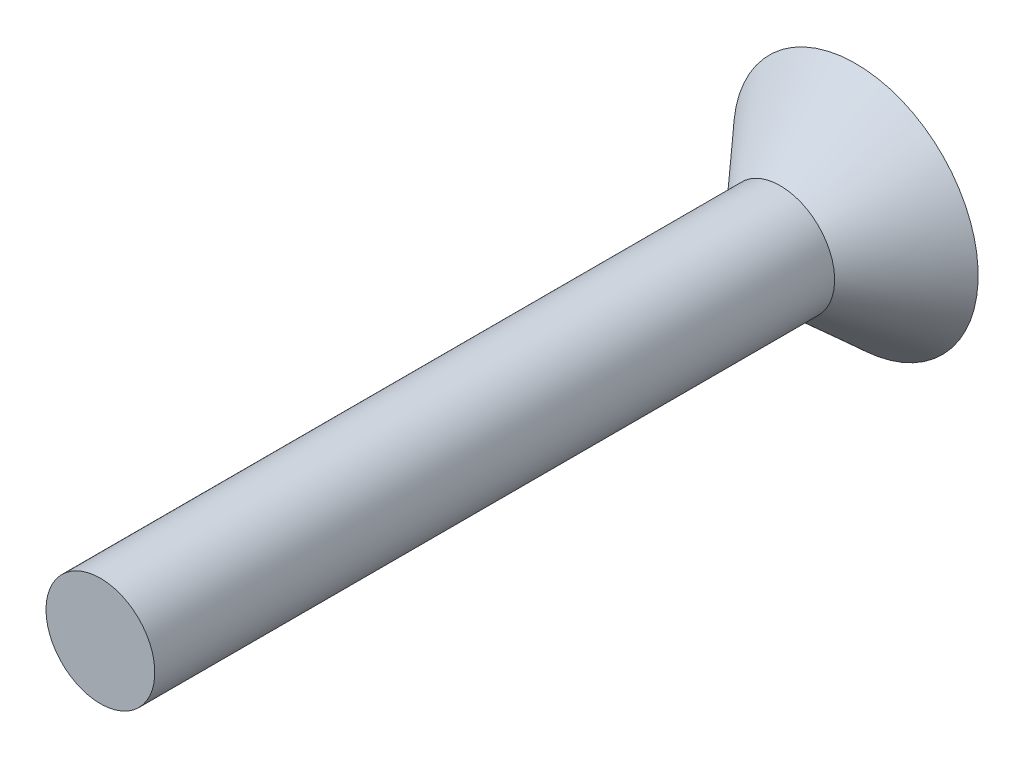
ISO-10303-21;
HEADER;
FILE_DESCRIPTION(('STEP AP214'),'2;1');
FILE_NAME('part.step','',(''),(''),'','','');
FILE_SCHEMA(('AUTOMOTIVE_DESIGN { 1 0 10303 214 1 1 1 1 }'));
ENDSEC;
DATA;
#1=APPLICATION_CONTEXT('core data for automotive mechanical design processes');
#2=APPLICATION_PROTOCOL_DEFINITION('international standard','automotive_design',2000,#1);
#3=PRODUCT_CONTEXT('',#1,'mechanical');
#4=PRODUCT('Part','Part','',(#3));
#5=PRODUCT_RELATED_PRODUCT_CATEGORY('part','',(#4));
#6=PRODUCT_DEFINITION_FORMATION('','',#4);
#7=PRODUCT_DEFINITION_CONTEXT('part definition',#1,'design');
#8=PRODUCT_DEFINITION('design','',#6,#7);
#9=PRODUCT_DEFINITION_SHAPE('','',#8);
#10=(LENGTH_UNIT() NAMED_UNIT(*) SI_UNIT(.MILLI.,.METRE.));
#11=(NAMED_UNIT(*) PLANE_ANGLE_UNIT() SI_UNIT($,.RADIAN.));
#12=(NAMED_UNIT(*) SI_UNIT($,.STERADIAN.) SOLID_ANGLE_UNIT());
#13=UNCERTAINTY_MEASURE_WITH_UNIT(LENGTH_MEASURE(1.E-05),#10,'distance_accuracy_value','');
#14=(GEOMETRIC_REPRESENTATION_CONTEXT(3) GLOBAL_UNCERTAINTY_ASSIGNED_CONTEXT((#13)) GLOBAL_UNIT_ASSIGNED_CONTEXT((#10,
#11,#12)) REPRESENTATION_CONTEXT('',''));
#15=CARTESIAN_POINT('',(0.,0.,0.));
#16=DIRECTION('',(0.,0.,1.));
#17=DIRECTION('',(1.,0.,0.));
#18=AXIS2_PLACEMENT_3D('',#15,#16,#17);
#19=CARTESIAN_POINT('',(0.,0.,-11.43));
#20=DIRECTION('',(0.,0.,-1.));
#21=DIRECTION('',(-1.,0.,0.));
#22=AXIS2_PLACEMENT_3D('',#19,#20,#21);
#23=PLANE('',#22);
#24=CARTESIAN_POINT('',(0.,0.,-11.43));
#25=DIRECTION('',(0.,0.,-1.));
#26=DIRECTION('',(-1.,0.,0.));
#27=AXIS2_PLACEMENT_3D('',#24,#25,#26);
#28=CIRCLE('',#27,2.0574);
#29=CARTESIAN_POINT('',(-2.0574,0.,-11.43));
#30=VERTEX_POINT('',#29);
#31=EDGE_CURVE('E11',#30,#30,#28,.T.);
#32=ORIENTED_EDGE('',*,*,#31,.T.);
#33=EDGE_LOOP('',(#32));
#34=FACE_BOUND('',#33,.T.);
#35=DIRECTION('',(0.707106781186548,0.707106781186548,0.));
#36=VECTOR('',#35,1.);
#37=CARTESIAN_POINT('',(0.2159,-0.5969,-11.43));
#38=LINE('',#37,#36);
#39=CARTESIAN_POINT('',(0.2159,-0.5969,-11.43));
#40=VERTEX_POINT('',#39);
#41=CARTESIAN_POINT('',(0.5969,-0.2159,-11.43));
#42=VERTEX_POINT('',#41);
#43=EDGE_CURVE('E176',#40,#42,#38,.T.);
#44=ORIENTED_EDGE('',*,*,#43,.T.);
#45=DIRECTION('',(1.,0.,0.));
#46=VECTOR('',#45,1.);
#47=CARTESIAN_POINT('',(0.5969,-0.2159,-11.43));
#48=LINE('',#47,#46);
#49=CARTESIAN_POINT('',(1.3462,-0.2159,-11.43));
#50=VERTEX_POINT('',#49);
#51=EDGE_CURVE('E57',#42,#50,#48,.T.);
#52=ORIENTED_EDGE('',*,*,#51,.T.);
#53=DIRECTION('',(0.,1.,0.));
#54=VECTOR('',#53,1.);
#55=CARTESIAN_POINT('',(1.3462,-0.2159,-11.43));
#56=LINE('',#55,#54);
#57=CARTESIAN_POINT('',(1.3462,0.2159,-11.43));
#58=VERTEX_POINT('',#57);
#59=EDGE_CURVE('E157',#50,#58,#56,.T.);
#60=ORIENTED_EDGE('',*,*,#59,.T.);
#61=DIRECTION('',(-1.,0.,0.));
#62=VECTOR('',#61,1.);
#63=CARTESIAN_POINT('',(1.3462,0.2159,-11.43));
#64=LINE('',#63,#62);
#65=CARTESIAN_POINT('',(0.5969,0.2159,-11.43));
#66=VERTEX_POINT('',#65);
#67=EDGE_CURVE('E165',#58,#66,#64,.T.);
#68=ORIENTED_EDGE('',*,*,#67,.T.);
#69=DIRECTION('',(-0.707106781186548,0.707106781186548,0.));
#70=VECTOR('',#69,1.);
#71=CARTESIAN_POINT('',(0.5969,0.2159,-11.43));
#72=LINE('',#71,#70);
#73=CARTESIAN_POINT('',(0.2159,0.5969,-11.43));
#74=VERTEX_POINT('',#73);
#75=EDGE_CURVE('E180',#66,#74,#72,.T.);
#76=ORIENTED_EDGE('',*,*,#75,.T.);
#77=DIRECTION('',(0.,1.,0.));
#78=VECTOR('',#77,1.);
#79=CARTESIAN_POINT('',(0.2159,0.5969,-11.43));
#80=LINE('',#79,#78);
#81=CARTESIAN_POINT('',(0.2159,1.3462,-11.43));
#82=VERTEX_POINT('',#81);
#83=EDGE_CURVE('E183',#74,#82,#80,.T.);
#84=ORIENTED_EDGE('',*,*,#83,.T.);
#85=DIRECTION('',(-1.,0.,0.));
#86=VECTOR('',#85,1.);
#87=CARTESIAN_POINT('',(0.2159,1.3462,-11.43));
#88=LINE('',#87,#86);
#89=CARTESIAN_POINT('',(-0.2159,1.3462,-11.43));
#90=VERTEX_POINT('',#89);
#91=EDGE_CURVE('E186',#82,#90,#88,.T.);
#92=ORIENTED_EDGE('',*,*,#91,.T.);
#93=DIRECTION('',(0.,-1.,0.));
#94=VECTOR('',#93,1.);
#95=CARTESIAN_POINT('',(-0.2159,1.3462,-11.43));
#96=LINE('',#95,#94);
#97=CARTESIAN_POINT('',(-0.2159,0.5969,-11.43));
#98=VERTEX_POINT('',#97);
#99=EDGE_CURVE('E189',#90,#98,#96,.T.);
#100=ORIENTED_EDGE('',*,*,#99,.T.);
#101=DIRECTION('',(-0.707106781186548,-0.707106781186548,0.));
#102=VECTOR('',#101,1.);
#103=CARTESIAN_POINT('',(-0.2159,0.5969,-11.43));
#104=LINE('',#103,#102);
#105=CARTESIAN_POINT('',(-0.5969,0.2159,-11.43));
#106=VERTEX_POINT('',#105);
#107=EDGE_CURVE('E192',#98,#106,#104,.T.);
#108=ORIENTED_EDGE('',*,*,#107,.T.);
#109=DIRECTION('',(-1.,0.,0.));
#110=VECTOR('',#109,1.);
#111=CARTESIAN_POINT('',(-0.5969,0.2159,-11.43));
#112=LINE('',#111,#110);
#113=CARTESIAN_POINT('',(-1.3462,0.2159,-11.43));
#114=VERTEX_POINT('',#113);
#115=EDGE_CURVE('E195',#106,#114,#112,.T.);
#116=ORIENTED_EDGE('',*,*,#115,.T.);
#117=DIRECTION('',(0.,-1.,0.));
#118=VECTOR('',#117,1.);
#119=CARTESIAN_POINT('',(-1.3462,0.2159,-11.43));
#120=LINE('',#119,#118);
#121=CARTESIAN_POINT('',(-1.3462,-0.2159,-11.43));
#122=VERTEX_POINT('',#121);
#123=EDGE_CURVE('E198',#114,#122,#120,.T.);
#124=ORIENTED_EDGE('',*,*,#123,.T.);
#125=DIRECTION('',(1.,0.,0.));
#126=VECTOR('',#125,1.);
#127=CARTESIAN_POINT('',(-1.3462,-0.2159,-11.43));
#128=LINE('',#127,#126);
#129=CARTESIAN_POINT('',(-0.5969,-0.2159,-11.43));
#130=VERTEX_POINT('',#129);
#131=EDGE_CURVE('E201',#122,#130,#128,.T.);
#132=ORIENTED_EDGE('',*,*,#131,.T.);
#133=DIRECTION('',(0.707106781186548,-0.707106781186548,0.));
#134=VECTOR('',#133,1.);
#135=CARTESIAN_POINT('',(-0.5969,-0.2159,-11.43));
#136=LINE('',#135,#134);
#137=CARTESIAN_POINT('',(-0.2159,-0.5969,-11.43));
#138=VERTEX_POINT('',#137);
#139=EDGE_CURVE('E204',#130,#138,#136,.T.);
#140=ORIENTED_EDGE('',*,*,#139,.T.);
#141=DIRECTION('',(0.,-1.,0.));
#142=VECTOR('',#141,1.);
#143=CARTESIAN_POINT('',(-0.2159,-0.5969,-11.43));
#144=LINE('',#143,#142);
#145=CARTESIAN_POINT('',(-0.2159,-1.3462,-11.43));
#146=VERTEX_POINT('',#145);
#147=EDGE_CURVE('E207',#138,#146,#144,.T.);
#148=ORIENTED_EDGE('',*,*,#147,.T.);
#149=DIRECTION('',(1.,0.,0.));
#150=VECTOR('',#149,1.);
#151=CARTESIAN_POINT('',(-0.2159,-1.3462,-11.43));
#152=LINE('',#151,#150);
#153=CARTESIAN_POINT('',(0.2159,-1.3462,-11.43));
#154=VERTEX_POINT('',#153);
#155=EDGE_CURVE('E210',#146,#154,#152,.T.);
#156=ORIENTED_EDGE('',*,*,#155,.T.);
#157=DIRECTION('',(0.,1.,0.));
#158=VECTOR('',#157,1.);
#159=CARTESIAN_POINT('',(0.2159,-1.3462,-11.43));
#160=LINE('',#159,#158);
#161=EDGE_CURVE('E213',#154,#40,#160,.T.);
#162=ORIENTED_EDGE('',*,*,#161,.T.);
#163=EDGE_LOOP('',(#44,#52,#60,#68,#76,#84,#92,#100,#108,#116,#124,#132,#140,#148,#156,#162));
#164=FACE_BOUND('',#163,.T.);
#165=ADVANCED_FACE('F43',(#34,#164),#23,.T.);
#166=CARTESIAN_POINT('',(0.,0.,-11.43));
#167=DIRECTION('',(0.,0.,-1.));
#168=DIRECTION('',(-1.,0.,0.));
#169=AXIS2_PLACEMENT_3D('',#166,#167,#168);
#170=CONICAL_SURFACE('',#169,2.0574,0.732815101786507);
#171=CARTESIAN_POINT('',(0.,0.,-10.16));
#172=DIRECTION('',(0.,0.,-1.));
#173=DIRECTION('',(-1.,0.,0.));
#174=AXIS2_PLACEMENT_3D('',#171,#172,#173);
#175=CIRCLE('',#174,0.9144);
#176=CARTESIAN_POINT('',(-0.9144,0.,-10.16));
#177=VERTEX_POINT('',#176);
#178=EDGE_CURVE('E50',#177,#177,#175,.T.);
#179=ORIENTED_EDGE('',*,*,#178,.T.);
#180=EDGE_LOOP('',(#179));
#181=FACE_BOUND('',#180,.T.);
#182=ORIENTED_EDGE('',*,*,#31,.F.);
#183=EDGE_LOOP('',(#182));
#184=FACE_BOUND('',#183,.T.);
#185=ADVANCED_FACE('F279',(#181,#184),#170,.T.);
#186=CARTESIAN_POINT('',(0.,0.,-15.24));
#187=DIRECTION('',(0.,0.,-1.));
#188=DIRECTION('',(-1.,0.,0.));
#189=AXIS2_PLACEMENT_3D('',#186,#187,#188);
#190=CYLINDRICAL_SURFACE('',#189,0.9144);
#191=CARTESIAN_POINT('',(0.,0.,1.27));
#192=DIRECTION('',(0.,0.,-1.));
#193=DIRECTION('',(-1.,0.,0.));
#194=AXIS2_PLACEMENT_3D('',#191,#192,#193);
#195=CIRCLE('',#194,0.9144);
#196=CARTESIAN_POINT('',(-0.9144,0.,1.27));
#197=VERTEX_POINT('',#196);
#198=EDGE_CURVE('E171',#197,#197,#195,.T.);
#199=ORIENTED_EDGE('',*,*,#198,.T.);
#200=EDGE_LOOP('',(#199));
#201=FACE_BOUND('',#200,.T.);
#202=ORIENTED_EDGE('',*,*,#178,.F.);
#203=EDGE_LOOP('',(#202));
#204=FACE_BOUND('',#203,.T.);
#205=ADVANCED_FACE('F282',(#201,#204),#190,.T.);
#206=CARTESIAN_POINT('',(0.,0.9144,1.27));
#207=DIRECTION('',(0.,0.,1.));
#208=DIRECTION('',(1.,0.,0.));
#209=AXIS2_PLACEMENT_3D('',#206,#207,#208);
#210=PLANE('',#209);
#211=ORIENTED_EDGE('',*,*,#198,.F.);
#212=EDGE_LOOP('',(#211));
#213=FACE_BOUND('',#212,.T.);
#214=ADVANCED_FACE('F284',(#213),#210,.T.);
#215=CARTESIAN_POINT('',(0.5969,-0.2159,-11.43));
#216=DIRECTION('',(0.,-0.997564050259824,0.0697564737441253));
#217=DIRECTION('',(0.,-0.0697564737441253,-0.997564050259824));
#218=AXIS2_PLACEMENT_3D('',#215,#216,#217);
#219=PLANE('',#218);
#220=ORIENTED_EDGE('',*,*,#51,.F.);
#221=DIRECTION('',(0.0288820236689141,-0.0697273732502733,-0.997147893809341));
#222=VECTOR('',#221,1.);
#223=CARTESIAN_POINT('',(0.597349464310636,-0.216985102834539,-11.445517693491));
#224=LINE('',#223,#222);
#225=CARTESIAN_POINT('',(0.574828948983047,-0.162615769299045,-10.668));
#226=VERTEX_POINT('',#225);
#227=EDGE_CURVE('E216',#226,#42,#224,.T.);
#228=ORIENTED_EDGE('',*,*,#227,.F.);
#229=DIRECTION('',(-1.,0.,0.));
#230=VECTOR('',#229,1.);
#231=CARTESIAN_POINT('',(0.5969,-0.162615769299045,-10.668));
#232=LINE('',#231,#230);
#233=CARTESIAN_POINT('',(1.29291576929904,-0.162615769299045,-10.668));
#234=VERTEX_POINT('',#233);
#235=EDGE_CURVE('E170',#226,#234,#232,.F.);
#236=ORIENTED_EDGE('',*,*,#235,.T.);
#237=DIRECTION('',(0.0695873743166647,-0.0695873743166647,-0.995145815783509));
#238=VECTOR('',#237,1.);
#239=CARTESIAN_POINT('',(1.3462,-0.2159,-11.43));
#240=LINE('',#239,#238);
#241=EDGE_CURVE('E159',#234,#50,#240,.T.);
#242=ORIENTED_EDGE('',*,*,#241,.T.);
#243=EDGE_LOOP('',(#220,#228,#236,#242));
#244=FACE_BOUND('',#243,.T.);
#245=ADVANCED_FACE('F168',(#244),#219,.F.);
#246=CARTESIAN_POINT('',(1.3462,-0.2159,-11.43));
#247=DIRECTION('',(0.997564050259824,0.,0.0697564737441253));
#248=DIRECTION('',(0.0697564737441253,0.,-0.997564050259824));
#249=AXIS2_PLACEMENT_3D('',#246,#247,#248);
#250=PLANE('',#249);
#251=ORIENTED_EDGE('',*,*,#59,.F.);
#252=ORIENTED_EDGE('',*,*,#241,.F.);
#253=DIRECTION('',(0.,-1.,0.));
#254=VECTOR('',#253,1.);
#255=CARTESIAN_POINT('',(1.29291576929904,-0.2159,-10.668));
#256=LINE('',#255,#254);
#257=CARTESIAN_POINT('',(1.29291576929904,0.162615769299045,-10.668));
#258=VERTEX_POINT('',#257);
#259=EDGE_CURVE('E246',#234,#258,#256,.F.);
#260=ORIENTED_EDGE('',*,*,#259,.T.);
#261=DIRECTION('',(0.0695873743166647,0.0695873743166647,-0.995145815783509));
#262=VECTOR('',#261,1.);
#263=CARTESIAN_POINT('',(1.3462,0.2159,-11.43));
#264=LINE('',#263,#262);
#265=EDGE_CURVE('E161',#258,#58,#264,.T.);
#266=ORIENTED_EDGE('',*,*,#265,.T.);
#267=EDGE_LOOP('',(#251,#252,#260,#266));
#268=FACE_BOUND('',#267,.T.);
#269=ADVANCED_FACE('F158',(#268),#250,.F.);
#270=CARTESIAN_POINT('',(1.3462,0.2159,-11.43));
#271=DIRECTION('',(0.,0.997564050259824,0.0697564737441253));
#272=DIRECTION('',(0.,-0.0697564737441253,0.997564050259824));
#273=AXIS2_PLACEMENT_3D('',#270,#271,#272);
#274=PLANE('',#273);
#275=ORIENTED_EDGE('',*,*,#67,.F.);
#276=ORIENTED_EDGE('',*,*,#265,.F.);
#277=DIRECTION('',(1.,0.,0.));
#278=VECTOR('',#277,1.);
#279=CARTESIAN_POINT('',(1.3462,0.162615769299045,-10.668));
#280=LINE('',#279,#278);
#281=CARTESIAN_POINT('',(0.574828948983047,0.162615769299045,-10.668));
#282=VERTEX_POINT('',#281);
#283=EDGE_CURVE('E248',#258,#282,#280,.F.);
#284=ORIENTED_EDGE('',*,*,#283,.T.);
#285=DIRECTION('',(0.0288820236689141,0.0697273732502733,-0.997147893809341));
#286=VECTOR('',#285,1.);
#287=CARTESIAN_POINT('',(0.597525044548505,0.217408991026088,-11.4515795770485));
#288=LINE('',#287,#286);
#289=EDGE_CURVE('E242',#282,#66,#288,.T.);
#290=ORIENTED_EDGE('',*,*,#289,.T.);
#291=EDGE_LOOP('',(#275,#276,#284,#290));
#292=FACE_BOUND('',#291,.T.);
#293=ADVANCED_FACE('F314',(#292),#274,.F.);
#294=CARTESIAN_POINT('',(0.5969,0.2159,-11.43));
#295=DIRECTION('',(0.70538430460664,0.70538430460664,0.0697564737441253));
#296=DIRECTION('',(-0.707106781186547,0.707106781186547,0.));
#297=AXIS2_PLACEMENT_3D('',#294,#295,#296);
#298=PLANE('',#297);
#299=ORIENTED_EDGE('',*,*,#75,.F.);
#300=ORIENTED_EDGE('',*,*,#289,.F.);
#301=DIRECTION('',(0.707106781186547,-0.707106781186547,0.));
#302=VECTOR('',#301,1.);
#303=CARTESIAN_POINT('',(0.559222359141046,0.178222359141046,-10.668));
#304=LINE('',#303,#302);
#305=CARTESIAN_POINT('',(0.162615769299045,0.574828948983047,-10.668));
#306=VERTEX_POINT('',#305);
#307=EDGE_CURVE('E250',#282,#306,#304,.F.);
#308=ORIENTED_EDGE('',*,*,#307,.T.);
#309=DIRECTION('',(0.0697273732502733,0.0288820236689141,-0.997147893809341));
#310=VECTOR('',#309,1.);
#311=CARTESIAN_POINT('',(0.216985102834539,0.597349464310636,-11.445517693491));
#312=LINE('',#311,#310);
#313=EDGE_CURVE('E240',#306,#74,#312,.T.);
#314=ORIENTED_EDGE('',*,*,#313,.T.);
#315=EDGE_LOOP('',(#299,#300,#308,#314));
#316=FACE_BOUND('',#315,.T.);
#317=ADVANCED_FACE('F322',(#316),#298,.F.);
#318=CARTESIAN_POINT('',(0.2159,0.5969,-11.43));
#319=DIRECTION('',(0.997564050259824,0.,0.0697564737441253));
#320=DIRECTION('',(0.0697564737441253,0.,-0.997564050259824));
#321=AXIS2_PLACEMENT_3D('',#318,#319,#320);
#322=PLANE('',#321);
#323=ORIENTED_EDGE('',*,*,#83,.F.);
#324=ORIENTED_EDGE('',*,*,#313,.F.);
#325=DIRECTION('',(0.,-1.,0.));
#326=VECTOR('',#325,1.);
#327=CARTESIAN_POINT('',(0.162615769299045,0.5969,-10.668));
#328=LINE('',#327,#326);
#329=CARTESIAN_POINT('',(0.162615769299045,1.29291576929904,-10.668));
#330=VERTEX_POINT('',#329);
#331=EDGE_CURVE('E252',#306,#330,#328,.F.);
#332=ORIENTED_EDGE('',*,*,#331,.T.);
#333=DIRECTION('',(0.0695873743166647,0.0695873743166647,-0.995145815783509));
#334=VECTOR('',#333,1.);
#335=CARTESIAN_POINT('',(0.2159,1.3462,-11.43));
#336=LINE('',#335,#334);
#337=EDGE_CURVE('E238',#330,#82,#336,.T.);
#338=ORIENTED_EDGE('',*,*,#337,.T.);
#339=EDGE_LOOP('',(#323,#324,#332,#338));
#340=FACE_BOUND('',#339,.T.);
#341=ADVANCED_FACE('F331',(#340),#322,.F.);
#342=CARTESIAN_POINT('',(0.2159,1.3462,-11.43));
#343=DIRECTION('',(0.,0.997564050259824,0.0697564737441253));
#344=DIRECTION('',(0.,-0.0697564737441253,0.997564050259824));
#345=AXIS2_PLACEMENT_3D('',#342,#343,#344);
#346=PLANE('',#345);
#347=ORIENTED_EDGE('',*,*,#91,.F.);
#348=ORIENTED_EDGE('',*,*,#337,.F.);
#349=DIRECTION('',(1.,0.,0.));
#350=VECTOR('',#349,1.);
#351=CARTESIAN_POINT('',(0.2159,1.29291576929904,-10.668));
#352=LINE('',#351,#350);
#353=CARTESIAN_POINT('',(-0.162615769299045,1.29291576929904,-10.668));
#354=VERTEX_POINT('',#353);
#355=EDGE_CURVE('E254',#330,#354,#352,.F.);
#356=ORIENTED_EDGE('',*,*,#355,.T.);
#357=DIRECTION('',(-0.0695873743166647,0.0695873743166647,-0.995145815783509));
#358=VECTOR('',#357,1.);
#359=CARTESIAN_POINT('',(-0.2159,1.3462,-11.43));
#360=LINE('',#359,#358);
#361=EDGE_CURVE('E236',#354,#90,#360,.T.);
#362=ORIENTED_EDGE('',*,*,#361,.T.);
#363=EDGE_LOOP('',(#347,#348,#356,#362));
#364=FACE_BOUND('',#363,.T.);
#365=ADVANCED_FACE('F340',(#364),#346,.F.);
#366=CARTESIAN_POINT('',(-0.2159,1.3462,-11.43));
#367=DIRECTION('',(-0.997564050259824,0.,0.0697564737441253));
#368=DIRECTION('',(0.0697564737441253,0.,0.997564050259824));
#369=AXIS2_PLACEMENT_3D('',#366,#367,#368);
#370=PLANE('',#369);
#371=ORIENTED_EDGE('',*,*,#99,.F.);
#372=ORIENTED_EDGE('',*,*,#361,.F.);
#373=DIRECTION('',(0.,1.,0.));
#374=VECTOR('',#373,1.);
#375=CARTESIAN_POINT('',(-0.162615769299045,1.3462,-10.668));
#376=LINE('',#375,#374);
#377=CARTESIAN_POINT('',(-0.162615769299045,0.574828948983047,-10.668));
#378=VERTEX_POINT('',#377);
#379=EDGE_CURVE('E256',#354,#378,#376,.F.);
#380=ORIENTED_EDGE('',*,*,#379,.T.);
#381=DIRECTION('',(-0.0697273732502733,0.0288820236689141,-0.997147893809341));
#382=VECTOR('',#381,1.);
#383=CARTESIAN_POINT('',(-0.217408991026088,0.597525044548505,-11.4515795770485));
#384=LINE('',#383,#382);
#385=EDGE_CURVE('E234',#378,#98,#384,.T.);
#386=ORIENTED_EDGE('',*,*,#385,.T.);
#387=EDGE_LOOP('',(#371,#372,#380,#386));
#388=FACE_BOUND('',#387,.T.);
#389=ADVANCED_FACE('F349',(#388),#370,.F.);
#390=CARTESIAN_POINT('',(-0.2159,0.5969,-11.43));
#391=DIRECTION('',(-0.70538430460664,0.70538430460664,0.0697564737441253));
#392=DIRECTION('',(-0.707106781186547,-0.707106781186547,0.));
#393=AXIS2_PLACEMENT_3D('',#390,#391,#392);
#394=PLANE('',#393);
#395=ORIENTED_EDGE('',*,*,#107,.F.);
#396=ORIENTED_EDGE('',*,*,#385,.F.);
#397=DIRECTION('',(0.707106781186547,0.707106781186547,0.));
#398=VECTOR('',#397,1.);
#399=CARTESIAN_POINT('',(-0.178222359141046,0.559222359141046,-10.668));
#400=LINE('',#399,#398);
#401=CARTESIAN_POINT('',(-0.574828948983047,0.162615769299045,-10.668));
#402=VERTEX_POINT('',#401);
#403=EDGE_CURVE('E258',#378,#402,#400,.F.);
#404=ORIENTED_EDGE('',*,*,#403,.T.);
#405=DIRECTION('',(-0.0288820236689141,0.0697273732502733,-0.997147893809341));
#406=VECTOR('',#405,1.);
#407=CARTESIAN_POINT('',(-0.597349464310636,0.216985102834539,-11.445517693491));
#408=LINE('',#407,#406);
#409=EDGE_CURVE('E232',#402,#106,#408,.T.);
#410=ORIENTED_EDGE('',*,*,#409,.T.);
#411=EDGE_LOOP('',(#395,#396,#404,#410));
#412=FACE_BOUND('',#411,.T.);
#413=ADVANCED_FACE('F358',(#412),#394,.F.);
#414=CARTESIAN_POINT('',(-0.5969,0.2159,-11.43));
#415=DIRECTION('',(0.,0.997564050259824,0.0697564737441253));
#416=DIRECTION('',(0.,-0.0697564737441253,0.997564050259824));
#417=AXIS2_PLACEMENT_3D('',#414,#415,#416);
#418=PLANE('',#417);
#419=ORIENTED_EDGE('',*,*,#115,.F.);
#420=ORIENTED_EDGE('',*,*,#409,.F.);
#421=DIRECTION('',(1.,0.,0.));
#422=VECTOR('',#421,1.);
#423=CARTESIAN_POINT('',(-0.5969,0.162615769299045,-10.668));
#424=LINE('',#423,#422);
#425=CARTESIAN_POINT('',(-1.29291576929904,0.162615769299045,-10.668));
#426=VERTEX_POINT('',#425);
#427=EDGE_CURVE('E260',#402,#426,#424,.F.);
#428=ORIENTED_EDGE('',*,*,#427,.T.);
#429=DIRECTION('',(-0.0695873743166647,0.0695873743166647,-0.995145815783509));
#430=VECTOR('',#429,1.);
#431=CARTESIAN_POINT('',(-1.3462,0.2159,-11.43));
#432=LINE('',#431,#430);
#433=EDGE_CURVE('E230',#426,#114,#432,.T.);
#434=ORIENTED_EDGE('',*,*,#433,.T.);
#435=EDGE_LOOP('',(#419,#420,#428,#434));
#436=FACE_BOUND('',#435,.T.);
#437=ADVANCED_FACE('F367',(#436),#418,.F.);
#438=CARTESIAN_POINT('',(-1.3462,0.2159,-11.43));
#439=DIRECTION('',(-0.997564050259824,0.,0.0697564737441253));
#440=DIRECTION('',(0.0697564737441253,0.,0.997564050259824));
#441=AXIS2_PLACEMENT_3D('',#438,#439,#440);
#442=PLANE('',#441);
#443=ORIENTED_EDGE('',*,*,#123,.F.);
#444=ORIENTED_EDGE('',*,*,#433,.F.);
#445=DIRECTION('',(0.,1.,0.));
#446=VECTOR('',#445,1.);
#447=CARTESIAN_POINT('',(-1.29291576929904,0.2159,-10.668));
#448=LINE('',#447,#446);
#449=CARTESIAN_POINT('',(-1.29291576929904,-0.162615769299045,-10.668));
#450=VERTEX_POINT('',#449);
#451=EDGE_CURVE('E262',#426,#450,#448,.F.);
#452=ORIENTED_EDGE('',*,*,#451,.T.);
#453=DIRECTION('',(-0.0695873743166647,-0.0695873743166647,-0.995145815783509));
#454=VECTOR('',#453,1.);
#455=CARTESIAN_POINT('',(-1.3462,-0.2159,-11.43));
#456=LINE('',#455,#454);
#457=EDGE_CURVE('E228',#450,#122,#456,.T.);
#458=ORIENTED_EDGE('',*,*,#457,.T.);
#459=EDGE_LOOP('',(#443,#444,#452,#458));
#460=FACE_BOUND('',#459,.T.);
#461=ADVANCED_FACE('F376',(#460),#442,.F.);
#462=CARTESIAN_POINT('',(-1.3462,-0.2159,-11.43));
#463=DIRECTION('',(0.,-0.997564050259824,0.0697564737441253));
#464=DIRECTION('',(0.,-0.0697564737441253,-0.997564050259824));
#465=AXIS2_PLACEMENT_3D('',#462,#463,#464);
#466=PLANE('',#465);
#467=ORIENTED_EDGE('',*,*,#131,.F.);
#468=ORIENTED_EDGE('',*,*,#457,.F.);
#469=DIRECTION('',(-1.,0.,0.));
#470=VECTOR('',#469,1.);
#471=CARTESIAN_POINT('',(-1.3462,-0.162615769299045,-10.668));
#472=LINE('',#471,#470);
#473=CARTESIAN_POINT('',(-0.574828948983047,-0.162615769299045,-10.668));
#474=VERTEX_POINT('',#473);
#475=EDGE_CURVE('E264',#450,#474,#472,.F.);
#476=ORIENTED_EDGE('',*,*,#475,.T.);
#477=DIRECTION('',(-0.0288820236689141,-0.0697273732502733,-0.997147893809341));
#478=VECTOR('',#477,1.);
#479=CARTESIAN_POINT('',(-0.597525044548505,-0.217408991026088,-11.4515795770485));
#480=LINE('',#479,#478);
#481=EDGE_CURVE('E226',#474,#130,#480,.T.);
#482=ORIENTED_EDGE('',*,*,#481,.T.);
#483=EDGE_LOOP('',(#467,#468,#476,#482));
#484=FACE_BOUND('',#483,.T.);
#485=ADVANCED_FACE('F385',(#484),#466,.F.);
#486=CARTESIAN_POINT('',(-0.5969,-0.2159,-11.43));
#487=DIRECTION('',(-0.70538430460664,-0.70538430460664,0.0697564737441253));
#488=DIRECTION('',(0.707106781186547,-0.707106781186547,0.));
#489=AXIS2_PLACEMENT_3D('',#486,#487,#488);
#490=PLANE('',#489);
#491=ORIENTED_EDGE('',*,*,#139,.F.);
#492=ORIENTED_EDGE('',*,*,#481,.F.);
#493=DIRECTION('',(-0.707106781186547,0.707106781186547,0.));
#494=VECTOR('',#493,1.);
#495=CARTESIAN_POINT('',(-0.559222359141046,-0.178222359141046,-10.668));
#496=LINE('',#495,#494);
#497=CARTESIAN_POINT('',(-0.162615769299045,-0.574828948983047,-10.668));
#498=VERTEX_POINT('',#497);
#499=EDGE_CURVE('E266',#474,#498,#496,.F.);
#500=ORIENTED_EDGE('',*,*,#499,.T.);
#501=DIRECTION('',(-0.0697273732502733,-0.0288820236689141,-0.997147893809341));
#502=VECTOR('',#501,1.);
#503=CARTESIAN_POINT('',(-0.216985102834539,-0.597349464310636,-11.445517693491));
#504=LINE('',#503,#502);
#505=EDGE_CURVE('E224',#498,#138,#504,.T.);
#506=ORIENTED_EDGE('',*,*,#505,.T.);
#507=EDGE_LOOP('',(#491,#492,#500,#506));
#508=FACE_BOUND('',#507,.T.);
#509=ADVANCED_FACE('F394',(#508),#490,.F.);
#510=CARTESIAN_POINT('',(-0.2159,-0.5969,-11.43));
#511=DIRECTION('',(-0.997564050259824,0.,0.0697564737441253));
#512=DIRECTION('',(0.0697564737441253,0.,0.997564050259824));
#513=AXIS2_PLACEMENT_3D('',#510,#511,#512);
#514=PLANE('',#513);
#515=ORIENTED_EDGE('',*,*,#147,.F.);
#516=ORIENTED_EDGE('',*,*,#505,.F.);
#517=DIRECTION('',(0.,1.,0.));
#518=VECTOR('',#517,1.);
#519=CARTESIAN_POINT('',(-0.162615769299045,-0.5969,-10.668));
#520=LINE('',#519,#518);
#521=CARTESIAN_POINT('',(-0.162615769299045,-1.29291576929904,-10.668));
#522=VERTEX_POINT('',#521);
#523=EDGE_CURVE('E268',#498,#522,#520,.F.);
#524=ORIENTED_EDGE('',*,*,#523,.T.);
#525=DIRECTION('',(-0.0695873743166647,-0.0695873743166647,-0.995145815783509));
#526=VECTOR('',#525,1.);
#527=CARTESIAN_POINT('',(-0.2159,-1.3462,-11.43));
#528=LINE('',#527,#526);
#529=EDGE_CURVE('E222',#522,#146,#528,.T.);
#530=ORIENTED_EDGE('',*,*,#529,.T.);
#531=EDGE_LOOP('',(#515,#516,#524,#530));
#532=FACE_BOUND('',#531,.T.);
#533=ADVANCED_FACE('F403',(#532),#514,.F.);
#534=CARTESIAN_POINT('',(-0.2159,-1.3462,-11.43));
#535=DIRECTION('',(0.,-0.997564050259824,0.0697564737441253));
#536=DIRECTION('',(0.,-0.0697564737441253,-0.997564050259824));
#537=AXIS2_PLACEMENT_3D('',#534,#535,#536);
#538=PLANE('',#537);
#539=ORIENTED_EDGE('',*,*,#155,.F.);
#540=ORIENTED_EDGE('',*,*,#529,.F.);
#541=DIRECTION('',(-1.,0.,0.));
#542=VECTOR('',#541,1.);
#543=CARTESIAN_POINT('',(-0.2159,-1.29291576929904,-10.668));
#544=LINE('',#543,#542);
#545=CARTESIAN_POINT('',(0.162615769299045,-1.29291576929904,-10.668));
#546=VERTEX_POINT('',#545);
#547=EDGE_CURVE('E270',#522,#546,#544,.F.);
#548=ORIENTED_EDGE('',*,*,#547,.T.);
#549=DIRECTION('',(0.0695873743166647,-0.0695873743166647,-0.995145815783509));
#550=VECTOR('',#549,1.);
#551=CARTESIAN_POINT('',(0.2159,-1.3462,-11.43));
#552=LINE('',#551,#550);
#553=EDGE_CURVE('E220',#546,#154,#552,.T.);
#554=ORIENTED_EDGE('',*,*,#553,.T.);
#555=EDGE_LOOP('',(#539,#540,#548,#554));
#556=FACE_BOUND('',#555,.T.);
#557=ADVANCED_FACE('F412',(#556),#538,.F.);
#558=CARTESIAN_POINT('',(0.2159,-1.3462,-11.43));
#559=DIRECTION('',(0.997564050259824,0.,0.0697564737441253));
#560=DIRECTION('',(0.0697564737441253,0.,-0.997564050259824));
#561=AXIS2_PLACEMENT_3D('',#558,#559,#560);
#562=PLANE('',#561);
#563=ORIENTED_EDGE('',*,*,#161,.F.);
#564=ORIENTED_EDGE('',*,*,#553,.F.);
#565=DIRECTION('',(0.,-1.,0.));
#566=VECTOR('',#565,1.);
#567=CARTESIAN_POINT('',(0.162615769299045,-1.3462,-10.668));
#568=LINE('',#567,#566);
#569=CARTESIAN_POINT('',(0.162615769299045,-0.574828948983047,-10.668));
#570=VERTEX_POINT('',#569);
#571=EDGE_CURVE('E272',#546,#570,#568,.F.);
#572=ORIENTED_EDGE('',*,*,#571,.T.);
#573=DIRECTION('',(0.0697273732502733,-0.0288820236689141,-0.997147893809341));
#574=VECTOR('',#573,1.);
#575=CARTESIAN_POINT('',(0.217408991026088,-0.597525044548505,-11.4515795770485));
#576=LINE('',#575,#574);
#577=EDGE_CURVE('E218',#570,#40,#576,.T.);
#578=ORIENTED_EDGE('',*,*,#577,.T.);
#579=EDGE_LOOP('',(#563,#564,#572,#578));
#580=FACE_BOUND('',#579,.T.);
#581=ADVANCED_FACE('F421',(#580),#562,.F.);
#582=CARTESIAN_POINT('',(0.2159,-0.5969,-11.43));
#583=DIRECTION('',(0.70538430460664,-0.70538430460664,0.0697564737441253));
#584=DIRECTION('',(0.707106781186547,0.707106781186547,0.));
#585=AXIS2_PLACEMENT_3D('',#582,#583,#584);
#586=PLANE('',#585);
#587=ORIENTED_EDGE('',*,*,#43,.F.);
#588=ORIENTED_EDGE('',*,*,#577,.F.);
#589=DIRECTION('',(-0.707106781186547,-0.707106781186547,0.));
#590=VECTOR('',#589,1.);
#591=CARTESIAN_POINT('',(0.178222359141046,-0.559222359141046,-10.668));
#592=LINE('',#591,#590);
#593=EDGE_CURVE('E64',#570,#226,#592,.F.);
#594=ORIENTED_EDGE('',*,*,#593,.T.);
#595=ORIENTED_EDGE('',*,*,#227,.T.);
#596=EDGE_LOOP('',(#587,#588,#594,#595));
#597=FACE_BOUND('',#596,.T.);
#598=ADVANCED_FACE('F430',(#597),#586,.F.);
#599=CARTESIAN_POINT('',(0.,0.,-10.668));
#600=DIRECTION('',(0.,0.,1.));
#601=DIRECTION('',(1.,0.,0.));
#602=AXIS2_PLACEMENT_3D('',#599,#600,#601);
#603=PLANE('',#602);
#604=ORIENTED_EDGE('',*,*,#235,.F.);
#605=ORIENTED_EDGE('',*,*,#593,.F.);
#606=ORIENTED_EDGE('',*,*,#571,.F.);
#607=ORIENTED_EDGE('',*,*,#547,.F.);
#608=ORIENTED_EDGE('',*,*,#523,.F.);
#609=ORIENTED_EDGE('',*,*,#499,.F.);
#610=ORIENTED_EDGE('',*,*,#475,.F.);
#611=ORIENTED_EDGE('',*,*,#451,.F.);
#612=ORIENTED_EDGE('',*,*,#427,.F.);
#613=ORIENTED_EDGE('',*,*,#403,.F.);
#614=ORIENTED_EDGE('',*,*,#379,.F.);
#615=ORIENTED_EDGE('',*,*,#355,.F.);
#616=ORIENTED_EDGE('',*,*,#331,.F.);
#617=ORIENTED_EDGE('',*,*,#307,.F.);
#618=ORIENTED_EDGE('',*,*,#283,.F.);
#619=ORIENTED_EDGE('',*,*,#259,.F.);
#620=EDGE_LOOP('',(#604,#605,#606,#607,#608,#609,#610,#611,#612,#613,#614,#615,#616,#617,#618,#619));
#621=FACE_BOUND('',#620,.T.);
#622=ADVANCED_FACE('F439',(#621),#603,.F.);
#623=CLOSED_SHELL('',(#165,#185,#205,#214,#245,#269,#293,#317,#341,#365,#389,#413,#437,#461,
#485,#509,#533,#557,#581,#598,#622));
#624=MANIFOLD_SOLID_BREP('B2',#623);
#625=ADVANCED_BREP_SHAPE_REPRESENTATION('',(#18,#624),#14);
#626=SHAPE_DEFINITION_REPRESENTATION(#9,#625);
ENDSEC;
END-ISO-10303-21;
